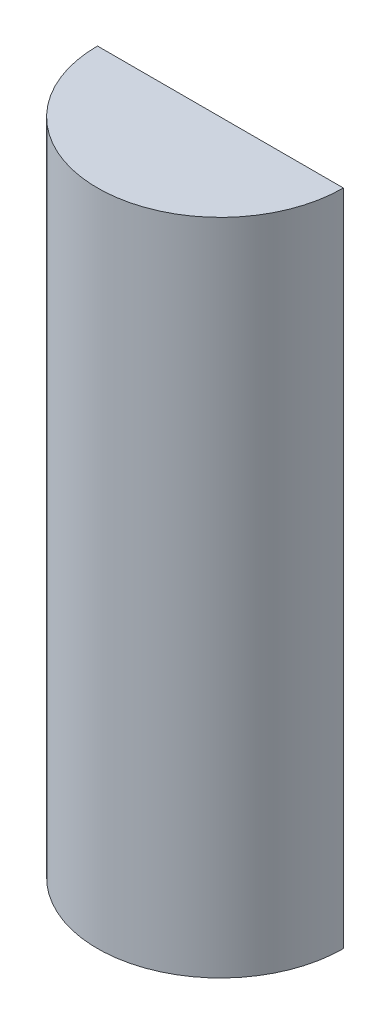
ISO-10303-21;
HEADER;
FILE_DESCRIPTION(('STEP AP214'),'2;1');
FILE_NAME('part.step','',(''),(''),'','','');
FILE_SCHEMA(('AUTOMOTIVE_DESIGN { 1 0 10303 214 1 1 1 1 }'));
ENDSEC;
DATA;
#1=APPLICATION_CONTEXT('core data for automotive mechanical design processes');
#2=APPLICATION_PROTOCOL_DEFINITION('international standard','automotive_design',2000,#1);
#3=PRODUCT_CONTEXT('',#1,'mechanical');
#4=PRODUCT('Part','Part','',(#3));
#5=PRODUCT_RELATED_PRODUCT_CATEGORY('part','',(#4));
#6=PRODUCT_DEFINITION_FORMATION('','',#4);
#7=PRODUCT_DEFINITION_CONTEXT('part definition',#1,'design');
#8=PRODUCT_DEFINITION('design','',#6,#7);
#9=PRODUCT_DEFINITION_SHAPE('','',#8);
#10=(LENGTH_UNIT() NAMED_UNIT(*) SI_UNIT(.MILLI.,.METRE.));
#11=(NAMED_UNIT(*) PLANE_ANGLE_UNIT() SI_UNIT($,.RADIAN.));
#12=(NAMED_UNIT(*) SI_UNIT($,.STERADIAN.) SOLID_ANGLE_UNIT());
#13=UNCERTAINTY_MEASURE_WITH_UNIT(LENGTH_MEASURE(1.E-05),#10,'distance_accuracy_value','');
#14=(GEOMETRIC_REPRESENTATION_CONTEXT(3) GLOBAL_UNCERTAINTY_ASSIGNED_CONTEXT((#13)) GLOBAL_UNIT_ASSIGNED_CONTEXT((#10,
#11,#12)) REPRESENTATION_CONTEXT('',''));
#15=CARTESIAN_POINT('',(0.,0.,0.));
#16=DIRECTION('',(0.,0.,1.));
#17=DIRECTION('',(1.,0.,0.));
#18=AXIS2_PLACEMENT_3D('',#15,#16,#17);
#19=CARTESIAN_POINT('',(0.,30.,0.));
#20=DIRECTION('',(0.,-1.,0.));
#21=DIRECTION('',(0.,0.,-1.));
#22=AXIS2_PLACEMENT_3D('',#19,#20,#21);
#23=CYLINDRICAL_SURFACE('',#22,5.6);
#24=CARTESIAN_POINT('',(0.,0.,0.));
#25=DIRECTION('',(0.,1.,0.));
#26=DIRECTION('',(0.,0.,1.));
#27=AXIS2_PLACEMENT_3D('',#24,#25,#26);
#28=CIRCLE('',#27,5.6);
#29=CARTESIAN_POINT('',(-5.6,0.,0.));
#30=VERTEX_POINT('',#29);
#31=CARTESIAN_POINT('',(5.6,0.,0.));
#32=VERTEX_POINT('',#31);
#33=EDGE_CURVE('E72',#30,#32,#28,.T.);
#34=ORIENTED_EDGE('',*,*,#33,.T.);
#35=DIRECTION('',(0.,-1.,0.));
#36=VECTOR('',#35,1.);
#37=CARTESIAN_POINT('',(5.6,30.,0.));
#38=LINE('',#37,#36);
#39=CARTESIAN_POINT('',(5.6,30.,0.));
#40=VERTEX_POINT('',#39);
#41=EDGE_CURVE('E11',#40,#32,#38,.T.);
#42=ORIENTED_EDGE('',*,*,#41,.F.);
#43=CARTESIAN_POINT('',(0.,30.,0.));
#44=DIRECTION('',(0.,1.,0.));
#45=DIRECTION('',(0.,0.,1.));
#46=AXIS2_PLACEMENT_3D('',#43,#44,#45);
#47=CIRCLE('',#46,5.6);
#48=CARTESIAN_POINT('',(-5.6,30.,0.));
#49=VERTEX_POINT('',#48);
#50=EDGE_CURVE('E71',#49,#40,#47,.T.);
#51=ORIENTED_EDGE('',*,*,#50,.F.);
#52=DIRECTION('',(0.,-1.,0.));
#53=VECTOR('',#52,1.);
#54=CARTESIAN_POINT('',(-5.6,30.,0.));
#55=LINE('',#54,#53);
#56=EDGE_CURVE('E49',#49,#30,#55,.T.);
#57=ORIENTED_EDGE('',*,*,#56,.T.);
#58=EDGE_LOOP('',(#34,#42,#51,#57));
#59=FACE_BOUND('',#58,.T.);
#60=ADVANCED_FACE('F41',(#59),#23,.T.);
#61=CARTESIAN_POINT('',(-5.6,30.,0.));
#62=DIRECTION('',(0.,0.,1.));
#63=DIRECTION('',(1.,0.,0.));
#64=AXIS2_PLACEMENT_3D('',#61,#62,#63);
#65=PLANE('',#64);
#66=DIRECTION('',(-1.,0.,0.));
#67=VECTOR('',#66,1.);
#68=CARTESIAN_POINT('',(-5.6,0.,0.));
#69=LINE('',#68,#67);
#70=EDGE_CURVE('E64',#32,#30,#69,.T.);
#71=ORIENTED_EDGE('',*,*,#70,.T.);
#72=ORIENTED_EDGE('',*,*,#56,.F.);
#73=DIRECTION('',(-1.,0.,0.));
#74=VECTOR('',#73,1.);
#75=CARTESIAN_POINT('',(-5.6,30.,0.));
#76=LINE('',#75,#74);
#77=EDGE_CURVE('E56',#40,#49,#76,.T.);
#78=ORIENTED_EDGE('',*,*,#77,.F.);
#79=ORIENTED_EDGE('',*,*,#41,.T.);
#80=EDGE_LOOP('',(#71,#72,#78,#79));
#81=FACE_BOUND('',#80,.T.);
#82=ADVANCED_FACE('F67',(#81),#65,.F.);
#83=CARTESIAN_POINT('',(0.,30.,0.));
#84=DIRECTION('',(0.,1.,0.));
#85=DIRECTION('',(0.,0.,1.));
#86=AXIS2_PLACEMENT_3D('',#83,#84,#85);
#87=PLANE('',#86);
#88=ORIENTED_EDGE('',*,*,#50,.T.);
#89=ORIENTED_EDGE('',*,*,#77,.T.);
#90=EDGE_LOOP('',(#88,#89));
#91=FACE_BOUND('',#90,.T.);
#92=ADVANCED_FACE('F79',(#91),#87,.T.);
#93=CARTESIAN_POINT('',(0.,0.,0.));
#94=DIRECTION('',(0.,1.,0.));
#95=DIRECTION('',(0.,0.,1.));
#96=AXIS2_PLACEMENT_3D('',#93,#94,#95);
#97=PLANE('',#96);
#98=ORIENTED_EDGE('',*,*,#33,.F.);
#99=ORIENTED_EDGE('',*,*,#70,.F.);
#100=EDGE_LOOP('',(#98,#99));
#101=FACE_BOUND('',#100,.T.);
#102=ADVANCED_FACE('F75',(#101),#97,.F.);
#103=CLOSED_SHELL('',(#60,#82,#92,#102));
#104=MANIFOLD_SOLID_BREP('B2',#103);
#105=ADVANCED_BREP_SHAPE_REPRESENTATION('',(#18,#104),#14);
#106=SHAPE_DEFINITION_REPRESENTATION(#9,#105);
ENDSEC;
END-ISO-10303-21;
